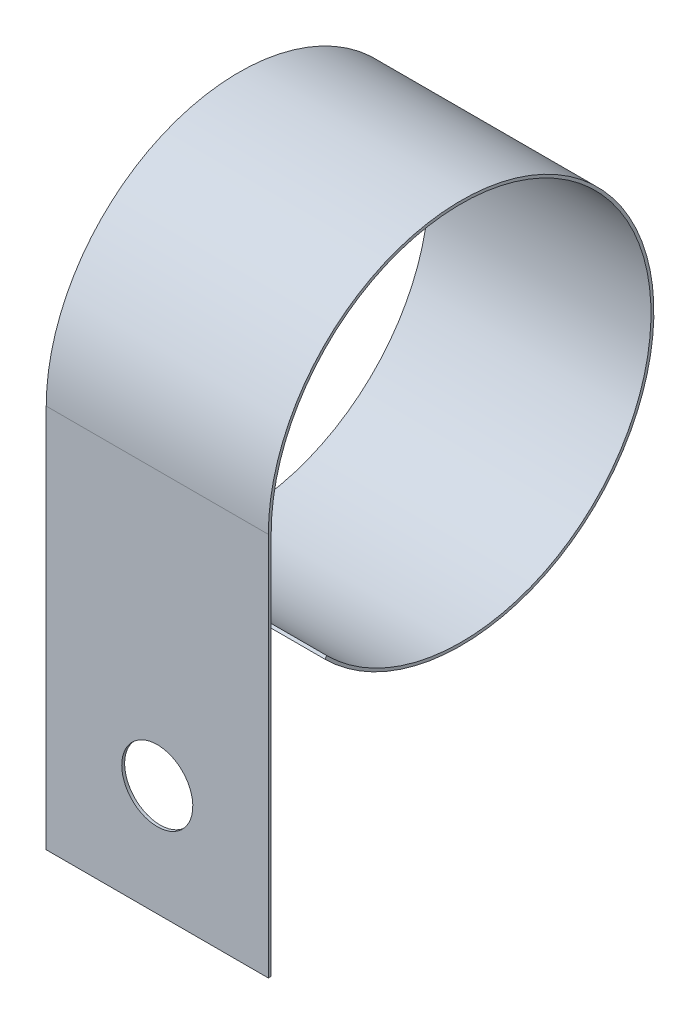
ISO-10303-21;
HEADER;
FILE_DESCRIPTION(('STEP AP214'),'2;1');
FILE_NAME('part.step','',(''),(''),'','','');
FILE_SCHEMA(('AUTOMOTIVE_DESIGN { 1 0 10303 214 1 1 1 1 }'));
ENDSEC;
DATA;
#1=APPLICATION_CONTEXT('core data for automotive mechanical design processes');
#2=APPLICATION_PROTOCOL_DEFINITION('international standard','automotive_design',2000,#1);
#3=PRODUCT_CONTEXT('',#1,'mechanical');
#4=PRODUCT('Part','Part','',(#3));
#5=PRODUCT_RELATED_PRODUCT_CATEGORY('part','',(#4));
#6=PRODUCT_DEFINITION_FORMATION('','',#4);
#7=PRODUCT_DEFINITION_CONTEXT('part definition',#1,'design');
#8=PRODUCT_DEFINITION('design','',#6,#7);
#9=PRODUCT_DEFINITION_SHAPE('','',#8);
#10=(LENGTH_UNIT() NAMED_UNIT(*) SI_UNIT(.MILLI.,.METRE.));
#11=(NAMED_UNIT(*) PLANE_ANGLE_UNIT() SI_UNIT($,.RADIAN.));
#12=(NAMED_UNIT(*) SI_UNIT($,.STERADIAN.) SOLID_ANGLE_UNIT());
#13=UNCERTAINTY_MEASURE_WITH_UNIT(LENGTH_MEASURE(1.E-05),#10,'distance_accuracy_value','');
#14=(GEOMETRIC_REPRESENTATION_CONTEXT(3) GLOBAL_UNCERTAINTY_ASSIGNED_CONTEXT((#13)) GLOBAL_UNIT_ASSIGNED_CONTEXT((#10,
#11,#12)) REPRESENTATION_CONTEXT('',''));
#15=CARTESIAN_POINT('',(0.,0.,0.));
#16=DIRECTION('',(0.,0.,1.));
#17=DIRECTION('',(1.,0.,0.));
#18=AXIS2_PLACEMENT_3D('',#15,#16,#17);
#19=CARTESIAN_POINT('',(5.,-17.3,8.68000000000003));
#20=DIRECTION('',(0.,0.,-1.));
#21=DIRECTION('',(0.,1.,0.));
#22=AXIS2_PLACEMENT_3D('',#19,#20,#21);
#23=PLANE('',#22);
#24=DIRECTION('',(0.,-1.,0.));
#25=VECTOR('',#24,1.);
#26=CARTESIAN_POINT('',(-5.,-17.3,8.68000000000003));
#27=LINE('',#26,#25);
#28=CARTESIAN_POINT('',(-5.,0.,8.68000000000003));
#29=VERTEX_POINT('',#28);
#30=CARTESIAN_POINT('',(-5.,-17.3,8.68000000000003));
#31=VERTEX_POINT('',#30);
#32=EDGE_CURVE('E112',#29,#31,#27,.T.);
#33=ORIENTED_EDGE('',*,*,#32,.T.);
#34=DIRECTION('',(-1.,0.,0.));
#35=VECTOR('',#34,1.);
#36=CARTESIAN_POINT('',(5.,-17.3,8.68000000000003));
#37=LINE('',#36,#35);
#38=CARTESIAN_POINT('',(5.,-17.3,8.68000000000003));
#39=VERTEX_POINT('',#38);
#40=EDGE_CURVE('E109',#39,#31,#37,.T.);
#41=ORIENTED_EDGE('',*,*,#40,.F.);
#42=DIRECTION('',(0.,-1.,0.));
#43=VECTOR('',#42,1.);
#44=CARTESIAN_POINT('',(5.,-17.3,8.68000000000003));
#45=LINE('',#44,#43);
#46=CARTESIAN_POINT('',(5.,0.,8.68000000000003));
#47=VERTEX_POINT('',#46);
#48=EDGE_CURVE('E98',#47,#39,#45,.T.);
#49=ORIENTED_EDGE('',*,*,#48,.F.);
#50=DIRECTION('',(-1.,0.,0.));
#51=VECTOR('',#50,1.);
#52=CARTESIAN_POINT('',(5.,0.,8.68000000000003));
#53=LINE('',#52,#51);
#54=EDGE_CURVE('E113',#47,#29,#53,.T.);
#55=ORIENTED_EDGE('',*,*,#54,.T.);
#56=EDGE_LOOP('',(#33,#41,#49,#55));
#57=FACE_BOUND('',#56,.T.);
#58=CARTESIAN_POINT('',(0.,-12.3,8.68000000000003));
#59=DIRECTION('',(0.,0.,-1.));
#60=DIRECTION('',(-1.,0.,0.));
#61=AXIS2_PLACEMENT_3D('',#58,#59,#60);
#62=CIRCLE('',#61,1.6);
#63=CARTESIAN_POINT('',(-1.6,-12.3,8.68000000000003));
#64=VERTEX_POINT('',#63);
#65=EDGE_CURVE('E126',#64,#64,#62,.T.);
#66=ORIENTED_EDGE('',*,*,#65,.T.);
#67=EDGE_LOOP('',(#66));
#68=FACE_BOUND('',#67,.T.);
#69=ADVANCED_FACE('F37',(#57,#68),#23,.F.);
#70=CARTESIAN_POINT('',(5.,-17.3,8.55000000000003));
#71=DIRECTION('',(0.,0.,1.));
#72=DIRECTION('',(0.,-1.,0.));
#73=AXIS2_PLACEMENT_3D('',#70,#71,#72);
#74=PLANE('',#73);
#75=DIRECTION('',(0.,1.,0.));
#76=VECTOR('',#75,1.);
#77=CARTESIAN_POINT('',(-5.,-17.3,8.55000000000003));
#78=LINE('',#77,#76);
#79=CARTESIAN_POINT('',(-5.,-17.3,8.55000000000003));
#80=VERTEX_POINT('',#79);
#81=CARTESIAN_POINT('',(-5.,0.,8.55000000000003));
#82=VERTEX_POINT('',#81);
#83=EDGE_CURVE('E83',#80,#82,#78,.T.);
#84=ORIENTED_EDGE('',*,*,#83,.T.);
#85=DIRECTION('',(-1.,0.,0.));
#86=VECTOR('',#85,1.);
#87=CARTESIAN_POINT('',(5.,0.,8.55000000000003));
#88=LINE('',#87,#86);
#89=CARTESIAN_POINT('',(5.,0.,8.55000000000003));
#90=VERTEX_POINT('',#89);
#91=EDGE_CURVE('E118',#90,#82,#88,.T.);
#92=ORIENTED_EDGE('',*,*,#91,.F.);
#93=DIRECTION('',(0.,1.,0.));
#94=VECTOR('',#93,1.);
#95=CARTESIAN_POINT('',(5.,-17.3,8.55000000000003));
#96=LINE('',#95,#94);
#97=CARTESIAN_POINT('',(5.,-17.3,8.55000000000003));
#98=VERTEX_POINT('',#97);
#99=EDGE_CURVE('E54',#98,#90,#96,.T.);
#100=ORIENTED_EDGE('',*,*,#99,.F.);
#101=DIRECTION('',(-1.,0.,0.));
#102=VECTOR('',#101,1.);
#103=CARTESIAN_POINT('',(5.,-17.3,8.55000000000003));
#104=LINE('',#103,#102);
#105=EDGE_CURVE('E114',#98,#80,#104,.T.);
#106=ORIENTED_EDGE('',*,*,#105,.T.);
#107=EDGE_LOOP('',(#84,#92,#100,#106));
#108=FACE_BOUND('',#107,.T.);
#109=CARTESIAN_POINT('',(0.,-12.3,8.55000000000002));
#110=DIRECTION('',(0.,0.,1.));
#111=DIRECTION('',(0.,-1.,0.));
#112=AXIS2_PLACEMENT_3D('',#109,#110,#111);
#113=CIRCLE('',#112,1.6);
#114=CARTESIAN_POINT('',(0.,-13.9,8.55000000000002));
#115=VERTEX_POINT('',#114);
#116=EDGE_CURVE('E152',#115,#115,#113,.T.);
#117=ORIENTED_EDGE('',*,*,#116,.T.);
#118=EDGE_LOOP('',(#117));
#119=FACE_BOUND('',#118,.T.);
#120=ADVANCED_FACE('F146',(#108,#119),#74,.F.);
#121=CARTESIAN_POINT('',(5.,0.,0.));
#122=DIRECTION('',(-1.,0.,0.));
#123=DIRECTION('',(0.,0.,1.));
#124=AXIS2_PLACEMENT_3D('',#121,#122,#123);
#125=CYLINDRICAL_SURFACE('',#124,8.55000000000003);
#126=CARTESIAN_POINT('',(-5.,0.,0.));
#127=DIRECTION('',(-1.,0.,0.));
#128=DIRECTION('',(0.,0.,1.));
#129=AXIS2_PLACEMENT_3D('',#126,#127,#128);
#130=CIRCLE('',#129,8.55000000000003);
#131=CARTESIAN_POINT('',(-5.,-6.04576297914498,6.04576297914503));
#132=VERTEX_POINT('',#131);
#133=EDGE_CURVE('E122',#82,#132,#130,.T.);
#134=ORIENTED_EDGE('',*,*,#133,.T.);
#135=DIRECTION('',(-1.,0.,0.));
#136=VECTOR('',#135,1.);
#137=CARTESIAN_POINT('',(5.,-6.04576297914498,6.04576297914503));
#138=LINE('',#137,#136);
#139=CARTESIAN_POINT('',(5.,-6.04576297914498,6.04576297914503));
#140=VERTEX_POINT('',#139);
#141=EDGE_CURVE('E11',#140,#132,#138,.T.);
#142=ORIENTED_EDGE('',*,*,#141,.F.);
#143=CARTESIAN_POINT('',(5.,0.,0.));
#144=DIRECTION('',(-1.,0.,0.));
#145=DIRECTION('',(0.,0.,1.));
#146=AXIS2_PLACEMENT_3D('',#143,#144,#145);
#147=CIRCLE('',#146,8.55000000000003);
#148=EDGE_CURVE('E133',#90,#140,#147,.T.);
#149=ORIENTED_EDGE('',*,*,#148,.F.);
#150=ORIENTED_EDGE('',*,*,#91,.T.);
#151=EDGE_LOOP('',(#134,#142,#149,#150));
#152=FACE_BOUND('',#151,.T.);
#153=ADVANCED_FACE('F39',(#152),#125,.F.);
#154=CARTESIAN_POINT('',(5.,-6.13768686069923,6.13768686069928));
#155=DIRECTION('',(0.,-0.707106781186551,-0.707106781186544));
#156=DIRECTION('',(0.,0.707106781186544,-0.707106781186551));
#157=AXIS2_PLACEMENT_3D('',#154,#155,#156);
#158=PLANE('',#157);
#159=DIRECTION('',(0.,-0.707106781186544,0.707106781186551));
#160=VECTOR('',#159,1.);
#161=CARTESIAN_POINT('',(-5.,-6.13768686069923,6.13768686069928));
#162=LINE('',#161,#160);
#163=CARTESIAN_POINT('',(-5.,-6.13768686069923,6.13768686069928));
#164=VERTEX_POINT('',#163);
#165=EDGE_CURVE('E125',#132,#164,#162,.T.);
#166=ORIENTED_EDGE('',*,*,#165,.T.);
#167=DIRECTION('',(-1.,0.,0.));
#168=VECTOR('',#167,1.);
#169=CARTESIAN_POINT('',(5.,-6.13768686069923,6.13768686069928));
#170=LINE('',#169,#168);
#171=CARTESIAN_POINT('',(5.,-6.13768686069923,6.13768686069928));
#172=VERTEX_POINT('',#171);
#173=EDGE_CURVE('E46',#172,#164,#170,.T.);
#174=ORIENTED_EDGE('',*,*,#173,.F.);
#175=DIRECTION('',(0.,-0.707106781186544,0.707106781186551));
#176=VECTOR('',#175,1.);
#177=CARTESIAN_POINT('',(5.,-6.13768686069923,6.13768686069928));
#178=LINE('',#177,#176);
#179=EDGE_CURVE('E91',#140,#172,#178,.T.);
#180=ORIENTED_EDGE('',*,*,#179,.F.);
#181=ORIENTED_EDGE('',*,*,#141,.T.);
#182=EDGE_LOOP('',(#166,#174,#180,#181));
#183=FACE_BOUND('',#182,.T.);
#184=ADVANCED_FACE('F176',(#183),#158,.F.);
#185=CARTESIAN_POINT('',(5.,0.,0.));
#186=DIRECTION('',(-1.,0.,0.));
#187=DIRECTION('',(0.,0.,1.));
#188=AXIS2_PLACEMENT_3D('',#185,#186,#187);
#189=CYLINDRICAL_SURFACE('',#188,8.68000000000003);
#190=CARTESIAN_POINT('',(-5.,0.,0.));
#191=DIRECTION('',(1.,0.,0.));
#192=DIRECTION('',(0.,0.,1.));
#193=AXIS2_PLACEMENT_3D('',#190,#191,#192);
#194=CIRCLE('',#193,8.68000000000003);
#195=EDGE_CURVE('E128',#164,#29,#194,.T.);
#196=ORIENTED_EDGE('',*,*,#195,.T.);
#197=ORIENTED_EDGE('',*,*,#54,.F.);
#198=CARTESIAN_POINT('',(5.,0.,0.));
#199=DIRECTION('',(1.,0.,0.));
#200=DIRECTION('',(0.,0.,1.));
#201=AXIS2_PLACEMENT_3D('',#198,#199,#200);
#202=CIRCLE('',#201,8.68000000000003);
#203=EDGE_CURVE('E104',#172,#47,#202,.T.);
#204=ORIENTED_EDGE('',*,*,#203,.F.);
#205=ORIENTED_EDGE('',*,*,#173,.T.);
#206=EDGE_LOOP('',(#196,#197,#204,#205));
#207=FACE_BOUND('',#206,.T.);
#208=ADVANCED_FACE('F139',(#207),#189,.T.);
#209=CARTESIAN_POINT('',(5.,-17.3,8.55000000000003));
#210=DIRECTION('',(0.,1.,0.));
#211=DIRECTION('',(0.,0.,1.));
#212=AXIS2_PLACEMENT_3D('',#209,#210,#211);
#213=PLANE('',#212);
#214=DIRECTION('',(0.,0.,-1.));
#215=VECTOR('',#214,1.);
#216=CARTESIAN_POINT('',(-5.,-17.3,8.55000000000003));
#217=LINE('',#216,#215);
#218=EDGE_CURVE('E77',#31,#80,#217,.T.);
#219=ORIENTED_EDGE('',*,*,#218,.T.);
#220=ORIENTED_EDGE('',*,*,#105,.F.);
#221=DIRECTION('',(0.,0.,-1.));
#222=VECTOR('',#221,1.);
#223=CARTESIAN_POINT('',(5.,-17.3,8.55000000000003));
#224=LINE('',#223,#222);
#225=EDGE_CURVE('E102',#39,#98,#224,.T.);
#226=ORIENTED_EDGE('',*,*,#225,.F.);
#227=ORIENTED_EDGE('',*,*,#40,.T.);
#228=EDGE_LOOP('',(#219,#220,#226,#227));
#229=FACE_BOUND('',#228,.T.);
#230=ADVANCED_FACE('F116',(#229),#213,.F.);
#231=CARTESIAN_POINT('',(5.,0.,0.));
#232=DIRECTION('',(-1.,0.,0.));
#233=DIRECTION('',(0.,0.,1.));
#234=AXIS2_PLACEMENT_3D('',#231,#232,#233);
#235=PLANE('',#234);
#236=ORIENTED_EDGE('',*,*,#148,.T.);
#237=ORIENTED_EDGE('',*,*,#179,.T.);
#238=ORIENTED_EDGE('',*,*,#203,.T.);
#239=ORIENTED_EDGE('',*,*,#48,.T.);
#240=ORIENTED_EDGE('',*,*,#225,.T.);
#241=ORIENTED_EDGE('',*,*,#99,.T.);
#242=EDGE_LOOP('',(#236,#237,#238,#239,#240,#241));
#243=FACE_BOUND('',#242,.T.);
#244=ADVANCED_FACE('F100',(#243),#235,.F.);
#245=CARTESIAN_POINT('',(-5.,0.,0.));
#246=DIRECTION('',(-1.,0.,0.));
#247=DIRECTION('',(0.,0.,1.));
#248=AXIS2_PLACEMENT_3D('',#245,#246,#247);
#249=PLANE('',#248);
#250=ORIENTED_EDGE('',*,*,#133,.F.);
#251=ORIENTED_EDGE('',*,*,#83,.F.);
#252=ORIENTED_EDGE('',*,*,#218,.F.);
#253=ORIENTED_EDGE('',*,*,#32,.F.);
#254=ORIENTED_EDGE('',*,*,#195,.F.);
#255=ORIENTED_EDGE('',*,*,#165,.F.);
#256=EDGE_LOOP('',(#250,#251,#252,#253,#254,#255));
#257=FACE_BOUND('',#256,.T.);
#258=ADVANCED_FACE('F142',(#257),#249,.T.);
#259=CARTESIAN_POINT('',(0.,-12.3,-8.68100000000003));
#260=DIRECTION('',(0.,0.,1.));
#261=DIRECTION('',(1.,0.,0.));
#262=AXIS2_PLACEMENT_3D('',#259,#260,#261);
#263=CYLINDRICAL_SURFACE('',#262,1.6);
#264=ORIENTED_EDGE('',*,*,#65,.F.);
#265=EDGE_LOOP('',(#264));
#266=FACE_BOUND('',#265,.T.);
#267=ORIENTED_EDGE('',*,*,#116,.F.);
#268=EDGE_LOOP('',(#267));
#269=FACE_BOUND('',#268,.T.);
#270=ADVANCED_FACE('F161',(#266,#269),#263,.F.);
#271=CLOSED_SHELL('',(#69,#120,#153,#184,#208,#230,#244,#258,#270));
#272=MANIFOLD_SOLID_BREP('B2',#271);
#273=ADVANCED_BREP_SHAPE_REPRESENTATION('',(#18,#272),#14);
#274=SHAPE_DEFINITION_REPRESENTATION(#9,#273);
ENDSEC;
END-ISO-10303-21;
